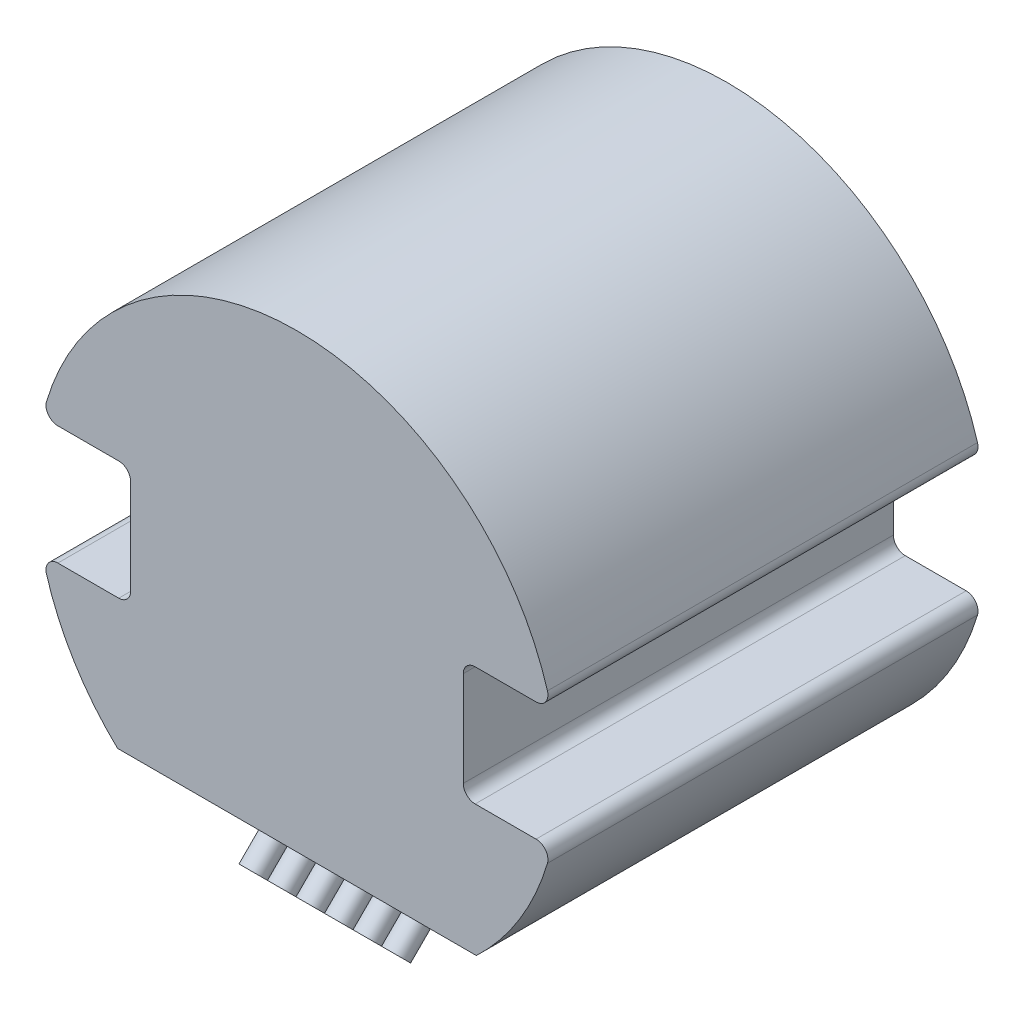
ISO-10303-21;
HEADER;
FILE_DESCRIPTION(('STEP AP214'),'2;1');
FILE_NAME('part.step','',(''),(''),'','','');
FILE_SCHEMA(('AUTOMOTIVE_DESIGN { 1 0 10303 214 1 1 1 1 }'));
ENDSEC;
DATA;
#1=APPLICATION_CONTEXT('core data for automotive mechanical design processes');
#2=APPLICATION_PROTOCOL_DEFINITION('international standard','automotive_design',2000,#1);
#3=PRODUCT_CONTEXT('',#1,'mechanical');
#4=PRODUCT('Part','Part','',(#3));
#5=PRODUCT_RELATED_PRODUCT_CATEGORY('part','',(#4));
#6=PRODUCT_DEFINITION_FORMATION('','',#4);
#7=PRODUCT_DEFINITION_CONTEXT('part definition',#1,'design');
#8=PRODUCT_DEFINITION('design','',#6,#7);
#9=PRODUCT_DEFINITION_SHAPE('','',#8);
#10=(LENGTH_UNIT() NAMED_UNIT(*) SI_UNIT(.MILLI.,.METRE.));
#11=(NAMED_UNIT(*) PLANE_ANGLE_UNIT() SI_UNIT($,.RADIAN.));
#12=(NAMED_UNIT(*) SI_UNIT($,.STERADIAN.) SOLID_ANGLE_UNIT());
#13=UNCERTAINTY_MEASURE_WITH_UNIT(LENGTH_MEASURE(1.E-05),#10,'distance_accuracy_value','');
#14=(GEOMETRIC_REPRESENTATION_CONTEXT(3) GLOBAL_UNCERTAINTY_ASSIGNED_CONTEXT((#13)) GLOBAL_UNIT_ASSIGNED_CONTEXT((#10,
#11,#12)) REPRESENTATION_CONTEXT('',''));
#15=CARTESIAN_POINT('',(0.,0.,0.));
#16=DIRECTION('',(0.,0.,1.));
#17=DIRECTION('',(1.,0.,0.));
#18=AXIS2_PLACEMENT_3D('',#15,#16,#17);
#19=CARTESIAN_POINT('',(-7.54983443527075,-8.,14.1));
#20=DIRECTION('',(0.,1.,0.));
#21=DIRECTION('',(0.,0.,1.));
#22=AXIS2_PLACEMENT_3D('',#19,#20,#21);
#23=PLANE('',#22);
#24=CARTESIAN_POINT('',(0.6,-8.,14.1));
#25=DIRECTION('',(0.,1.,0.));
#26=DIRECTION('',(0.,0.,-1.));
#27=AXIS2_PLACEMENT_3D('',#24,#25,#26);
#28=ELLIPSE('',#27,0.707106781186549,0.5);
#29=CARTESIAN_POINT('',(1.1,-8.00000000000001,14.1));
#30=VERTEX_POINT('',#29);
#31=CARTESIAN_POINT('',(0.0999999999999994,-8.,14.1));
#32=VERTEX_POINT('',#31);
#33=EDGE_CURVE('E48',#30,#32,#28,.F.);
#34=ORIENTED_EDGE('',*,*,#33,.F.);
#35=DIRECTION('',(-1.,0.,0.));
#36=VECTOR('',#35,1.);
#37=CARTESIAN_POINT('',(-7.54983443527075,-8.,14.1));
#38=LINE('',#37,#36);
#39=CARTESIAN_POINT('',(1.3,-8.,14.1));
#40=VERTEX_POINT('',#39);
#41=EDGE_CURVE('E197',#40,#30,#38,.T.);
#42=ORIENTED_EDGE('',*,*,#41,.F.);
#43=CARTESIAN_POINT('',(1.8,-8.,14.1));
#44=DIRECTION('',(0.,1.,0.));
#45=DIRECTION('',(0.,0.,-1.));
#46=AXIS2_PLACEMENT_3D('',#43,#44,#45);
#47=ELLIPSE('',#46,0.707106781186549,0.5);
#48=CARTESIAN_POINT('',(2.3,-8.00000000000001,14.1));
#49=VERTEX_POINT('',#48);
#50=EDGE_CURVE('E54',#49,#40,#47,.F.);
#51=ORIENTED_EDGE('',*,*,#50,.F.);
#52=CARTESIAN_POINT('',(2.5,-8.,14.1));
#53=VERTEX_POINT('',#52);
#54=EDGE_CURVE('E205',#53,#49,#38,.T.);
#55=ORIENTED_EDGE('',*,*,#54,.F.);
#56=CARTESIAN_POINT('',(3.,-8.,14.1));
#57=DIRECTION('',(0.,1.,0.));
#58=DIRECTION('',(0.,0.,-1.));
#59=AXIS2_PLACEMENT_3D('',#56,#57,#58);
#60=ELLIPSE('',#59,0.70710678118655,0.500000000000001);
#61=CARTESIAN_POINT('',(3.5,-8.00000000000001,14.1));
#62=VERTEX_POINT('',#61);
#63=EDGE_CURVE('E356',#62,#53,#60,.F.);
#64=ORIENTED_EDGE('',*,*,#63,.F.);
#65=CARTESIAN_POINT('',(7.54983443527075,-8.,14.1));
#66=VERTEX_POINT('',#65);
#67=EDGE_CURVE('E207',#66,#62,#38,.T.);
#68=ORIENTED_EDGE('',*,*,#67,.F.);
#69=DIRECTION('',(0.,0.,1.));
#70=VECTOR('',#69,1.);
#71=CARTESIAN_POINT('',(7.54983443527075,-8.,14.1));
#72=LINE('',#71,#70);
#73=CARTESIAN_POINT('',(7.54983443527075,-8.,18.1));
#74=VERTEX_POINT('',#73);
#75=EDGE_CURVE('E213',#66,#74,#72,.T.);
#76=ORIENTED_EDGE('',*,*,#75,.T.);
#77=DIRECTION('',(-1.,0.,0.));
#78=VECTOR('',#77,1.);
#79=CARTESIAN_POINT('',(-7.54983443527075,-8.,18.1));
#80=LINE('',#79,#78);
#81=CARTESIAN_POINT('',(-7.54983443527075,-8.,18.1));
#82=VERTEX_POINT('',#81);
#83=EDGE_CURVE('E216',#74,#82,#80,.T.);
#84=ORIENTED_EDGE('',*,*,#83,.T.);
#85=DIRECTION('',(0.,0.,1.));
#86=VECTOR('',#85,1.);
#87=CARTESIAN_POINT('',(-7.54983443527075,-8.,14.1));
#88=LINE('',#87,#86);
#89=CARTESIAN_POINT('',(-7.54983443527075,-8.,14.1));
#90=VERTEX_POINT('',#89);
#91=EDGE_CURVE('E220',#90,#82,#88,.T.);
#92=ORIENTED_EDGE('',*,*,#91,.F.);
#93=CARTESIAN_POINT('',(-3.5,-8.,14.1));
#94=VERTEX_POINT('',#93);
#95=EDGE_CURVE('E208',#94,#90,#38,.T.);
#96=ORIENTED_EDGE('',*,*,#95,.F.);
#97=CARTESIAN_POINT('',(-3.,-8.,14.1));
#98=DIRECTION('',(0.,1.,0.));
#99=DIRECTION('',(0.,0.,-1.));
#100=AXIS2_PLACEMENT_3D('',#97,#98,#99);
#101=ELLIPSE('',#100,0.70710678118655,0.500000000000001);
#102=CARTESIAN_POINT('',(-2.5,-8.00000000000001,14.1));
#103=VERTEX_POINT('',#102);
#104=EDGE_CURVE('E368',#103,#94,#101,.F.);
#105=ORIENTED_EDGE('',*,*,#104,.F.);
#106=CARTESIAN_POINT('',(-2.3,-8.,14.1));
#107=VERTEX_POINT('',#106);
#108=EDGE_CURVE('E384',#107,#103,#38,.T.);
#109=ORIENTED_EDGE('',*,*,#108,.F.);
#110=CARTESIAN_POINT('',(-1.8,-8.,14.1));
#111=DIRECTION('',(0.,1.,0.));
#112=DIRECTION('',(0.,0.,-1.));
#113=AXIS2_PLACEMENT_3D('',#110,#111,#112);
#114=ELLIPSE('',#113,0.707106781186549,0.5);
#115=CARTESIAN_POINT('',(-1.3,-8.00000000000001,14.1));
#116=VERTEX_POINT('',#115);
#117=EDGE_CURVE('E373',#116,#107,#114,.F.);
#118=ORIENTED_EDGE('',*,*,#117,.F.);
#119=CARTESIAN_POINT('',(-1.1,-8.,14.1));
#120=VERTEX_POINT('',#119);
#121=EDGE_CURVE('E209',#120,#116,#38,.T.);
#122=ORIENTED_EDGE('',*,*,#121,.F.);
#123=CARTESIAN_POINT('',(-0.6,-8.,14.1));
#124=DIRECTION('',(0.,1.,0.));
#125=DIRECTION('',(0.,0.,-1.));
#126=AXIS2_PLACEMENT_3D('',#123,#124,#125);
#127=ELLIPSE('',#126,0.707106781186549,0.500000000000001);
#128=CARTESIAN_POINT('',(-0.0999999999999995,-8.00000000000001,14.1));
#129=VERTEX_POINT('',#128);
#130=EDGE_CURVE('E219',#129,#120,#127,.F.);
#131=ORIENTED_EDGE('',*,*,#130,.F.);
#132=EDGE_CURVE('E199',#32,#129,#38,.T.);
#133=ORIENTED_EDGE('',*,*,#132,.F.);
#134=EDGE_LOOP('',(#34,#42,#51,#55,#64,#68,#76,#84,#92,#96,#105,#109,#118,#122,#131,#133));
#135=FACE_BOUND('',#134,.T.);
#136=ADVANCED_FACE('F34',(#135),#23,.F.);
#137=CARTESIAN_POINT('',(0.,0.,14.1));
#138=DIRECTION('',(0.,0.,1.));
#139=DIRECTION('',(1.,0.,0.));
#140=AXIS2_PLACEMENT_3D('',#137,#138,#139);
#141=PLANE('',#140);
#142=ORIENTED_EDGE('',*,*,#41,.T.);
#143=CARTESIAN_POINT('',(0.6,-8.,14.1));
#144=DIRECTION('',(0.,0.,1.));
#145=DIRECTION('',(0.,1.,0.));
#146=AXIS2_PLACEMENT_3D('',#143,#144,#145);
#147=ELLIPSE('',#146,0.707106781186547,0.5);
#148=EDGE_CURVE('E11',#30,#32,#147,.F.);
#149=ORIENTED_EDGE('',*,*,#148,.T.);
#150=ORIENTED_EDGE('',*,*,#132,.T.);
#151=CARTESIAN_POINT('',(-0.6,-8.,14.1));
#152=DIRECTION('',(0.,0.,1.));
#153=DIRECTION('',(0.,1.,0.));
#154=AXIS2_PLACEMENT_3D('',#151,#152,#153);
#155=ELLIPSE('',#154,0.707106781186547,0.500000000000001);
#156=EDGE_CURVE('E341',#129,#120,#155,.F.);
#157=ORIENTED_EDGE('',*,*,#156,.T.);
#158=ORIENTED_EDGE('',*,*,#121,.T.);
#159=CARTESIAN_POINT('',(-1.8,-8.,14.1));
#160=DIRECTION('',(0.,0.,1.));
#161=DIRECTION('',(0.,1.,0.));
#162=AXIS2_PLACEMENT_3D('',#159,#160,#161);
#163=ELLIPSE('',#162,0.707106781186546,0.5);
#164=EDGE_CURVE('E344',#116,#107,#163,.F.);
#165=ORIENTED_EDGE('',*,*,#164,.T.);
#166=ORIENTED_EDGE('',*,*,#108,.T.);
#167=CARTESIAN_POINT('',(-3.,-8.,14.1));
#168=DIRECTION('',(0.,0.,1.));
#169=DIRECTION('',(0.,1.,0.));
#170=AXIS2_PLACEMENT_3D('',#167,#168,#169);
#171=ELLIPSE('',#170,0.707106781186547,0.500000000000001);
#172=EDGE_CURVE('E347',#103,#94,#171,.F.);
#173=ORIENTED_EDGE('',*,*,#172,.T.);
#174=ORIENTED_EDGE('',*,*,#95,.T.);
#175=CARTESIAN_POINT('',(0.,0.,14.1));
#176=DIRECTION('',(0.,0.,1.));
#177=DIRECTION('',(1.,0.,0.));
#178=AXIS2_PLACEMENT_3D('',#175,#176,#177);
#179=CIRCLE('',#178,11.);
#180=EDGE_CURVE('E214',#90,#66,#179,.T.);
#181=ORIENTED_EDGE('',*,*,#180,.T.);
#182=ORIENTED_EDGE('',*,*,#67,.T.);
#183=CARTESIAN_POINT('',(3.,-8.,14.1));
#184=DIRECTION('',(0.,0.,1.));
#185=DIRECTION('',(0.,1.,0.));
#186=AXIS2_PLACEMENT_3D('',#183,#184,#185);
#187=ELLIPSE('',#186,0.707106781186547,0.500000000000001);
#188=EDGE_CURVE('E350',#62,#53,#187,.F.);
#189=ORIENTED_EDGE('',*,*,#188,.T.);
#190=ORIENTED_EDGE('',*,*,#54,.T.);
#191=CARTESIAN_POINT('',(1.8,-8.,14.1));
#192=DIRECTION('',(0.,0.,1.));
#193=DIRECTION('',(0.,1.,0.));
#194=AXIS2_PLACEMENT_3D('',#191,#192,#193);
#195=ELLIPSE('',#194,0.707106781186546,0.5);
#196=EDGE_CURVE('E42',#49,#40,#195,.F.);
#197=ORIENTED_EDGE('',*,*,#196,.T.);
#198=EDGE_LOOP('',(#142,#149,#150,#157,#158,#165,#166,#173,#174,#181,#182,#189,#190,#197));
#199=FACE_BOUND('',#198,.T.);
#200=ADVANCED_FACE('F203',(#199),#141,.T.);
#201=CARTESIAN_POINT('',(0.,0.,18.1));
#202=DIRECTION('',(0.,0.,-1.));
#203=DIRECTION('',(-1.,0.,0.));
#204=AXIS2_PLACEMENT_3D('',#201,#202,#203);
#205=CYLINDRICAL_SURFACE('',#204,11.);
#206=CARTESIAN_POINT('',(0.,0.,0.));
#207=DIRECTION('',(0.,0.,1.));
#208=DIRECTION('',(1.,0.,0.));
#209=AXIS2_PLACEMENT_3D('',#206,#207,#208);
#210=CIRCLE('',#209,11.);
#211=CARTESIAN_POINT('',(-10.541463322499,-3.14285714285714,0.));
#212=VERTEX_POINT('',#211);
#213=CARTESIAN_POINT('',(10.541463322499,-3.14285714285714,0.));
#214=VERTEX_POINT('',#213);
#215=EDGE_CURVE('E235',#212,#214,#210,.T.);
#216=ORIENTED_EDGE('',*,*,#215,.T.);
#217=DIRECTION('',(0.,0.,-1.));
#218=VECTOR('',#217,1.);
#219=CARTESIAN_POINT('',(10.541463322499,-3.14285714285714,18.1));
#220=LINE('',#219,#218);
#221=CARTESIAN_POINT('',(10.541463322499,-3.14285714285714,18.1));
#222=VERTEX_POINT('',#221);
#223=EDGE_CURVE('E271',#214,#222,#220,.F.);
#224=ORIENTED_EDGE('',*,*,#223,.T.);
#225=CARTESIAN_POINT('',(0.,0.,18.1));
#226=DIRECTION('',(0.,0.,1.));
#227=DIRECTION('',(1.,0.,0.));
#228=AXIS2_PLACEMENT_3D('',#225,#226,#227);
#229=CIRCLE('',#228,11.);
#230=EDGE_CURVE('E266',#74,#222,#229,.T.);
#231=ORIENTED_EDGE('',*,*,#230,.F.);
#232=ORIENTED_EDGE('',*,*,#75,.F.);
#233=ORIENTED_EDGE('',*,*,#180,.F.);
#234=ORIENTED_EDGE('',*,*,#91,.T.);
#235=CARTESIAN_POINT('',(-10.541463322499,-3.14285714285714,18.1));
#236=VERTEX_POINT('',#235);
#237=EDGE_CURVE('E265',#236,#82,#229,.T.);
#238=ORIENTED_EDGE('',*,*,#237,.F.);
#239=DIRECTION('',(0.,0.,-1.));
#240=VECTOR('',#239,1.);
#241=CARTESIAN_POINT('',(-10.541463322499,-3.14285714285714,18.1));
#242=LINE('',#241,#240);
#243=EDGE_CURVE('E264',#236,#212,#242,.T.);
#244=ORIENTED_EDGE('',*,*,#243,.T.);
#245=EDGE_LOOP('',(#216,#224,#231,#232,#233,#234,#238,#244));
#246=FACE_BOUND('',#245,.T.);
#247=ADVANCED_FACE('F394',(#246),#205,.T.);
#248=CARTESIAN_POINT('',(10.541463322499,3.14285714285714,18.1));
#249=VERTEX_POINT('',#248);
#250=CARTESIAN_POINT('',(-10.541463322499,3.14285714285714,18.1));
#251=VERTEX_POINT('',#250);
#252=EDGE_CURVE('E261',#249,#251,#229,.T.);
#253=ORIENTED_EDGE('',*,*,#252,.F.);
#254=DIRECTION('',(0.,0.,-1.));
#255=VECTOR('',#254,1.);
#256=CARTESIAN_POINT('',(10.541463322499,3.14285714285714,18.1));
#257=LINE('',#256,#255);
#258=CARTESIAN_POINT('',(10.541463322499,3.14285714285714,0.));
#259=VERTEX_POINT('',#258);
#260=EDGE_CURVE('E308',#249,#259,#257,.T.);
#261=ORIENTED_EDGE('',*,*,#260,.T.);
#262=CARTESIAN_POINT('',(-10.541463322499,3.14285714285714,0.));
#263=VERTEX_POINT('',#262);
#264=EDGE_CURVE('E267',#259,#263,#210,.T.);
#265=ORIENTED_EDGE('',*,*,#264,.T.);
#266=DIRECTION('',(0.,0.,-1.));
#267=VECTOR('',#266,1.);
#268=CARTESIAN_POINT('',(-10.541463322499,3.14285714285714,18.1));
#269=LINE('',#268,#267);
#270=EDGE_CURVE('E305',#263,#251,#269,.F.);
#271=ORIENTED_EDGE('',*,*,#270,.T.);
#272=EDGE_LOOP('',(#253,#261,#265,#271));
#273=FACE_BOUND('',#272,.T.);
#274=ADVANCED_FACE('F457',(#273),#205,.T.);
#275=CARTESIAN_POINT('',(0.,0.,18.1));
#276=DIRECTION('',(0.,0.,1.));
#277=DIRECTION('',(1.,0.,0.));
#278=AXIS2_PLACEMENT_3D('',#275,#276,#277);
#279=PLANE('',#278);
#280=ORIENTED_EDGE('',*,*,#230,.T.);
#281=CARTESIAN_POINT('',(10.0623058987491,-3.,18.1));
#282=DIRECTION('',(0.,0.,1.));
#283=DIRECTION('',(1.,0.,0.));
#284=AXIS2_PLACEMENT_3D('',#281,#282,#283);
#285=CIRCLE('',#284,0.5);
#286=CARTESIAN_POINT('',(10.0623058987491,-2.5,18.1));
#287=VERTEX_POINT('',#286);
#288=EDGE_CURVE('E280',#222,#287,#285,.T.);
#289=ORIENTED_EDGE('',*,*,#288,.T.);
#290=DIRECTION('',(1.,0.,0.));
#291=VECTOR('',#290,1.);
#292=CARTESIAN_POINT('',(10.7121426428143,-2.5,18.1));
#293=LINE('',#292,#291);
#294=CARTESIAN_POINT('',(7.5,-2.5,18.1));
#295=VERTEX_POINT('',#294);
#296=EDGE_CURVE('E229',#295,#287,#293,.T.);
#297=ORIENTED_EDGE('',*,*,#296,.F.);
#298=CARTESIAN_POINT('',(7.5,-2.,18.1));
#299=DIRECTION('',(0.,0.,1.));
#300=DIRECTION('',(1.,0.,0.));
#301=AXIS2_PLACEMENT_3D('',#298,#299,#300);
#302=CIRCLE('',#301,0.5);
#303=CARTESIAN_POINT('',(7.,-2.,18.1));
#304=VERTEX_POINT('',#303);
#305=EDGE_CURVE('E325',#295,#304,#302,.F.);
#306=ORIENTED_EDGE('',*,*,#305,.T.);
#307=DIRECTION('',(0.,-1.,0.));
#308=VECTOR('',#307,1.);
#309=CARTESIAN_POINT('',(7.,2.5,18.1));
#310=LINE('',#309,#308);
#311=CARTESIAN_POINT('',(7.,2.,18.1));
#312=VERTEX_POINT('',#311);
#313=EDGE_CURVE('E239',#312,#304,#310,.T.);
#314=ORIENTED_EDGE('',*,*,#313,.F.);
#315=CARTESIAN_POINT('',(7.5,2.,18.1));
#316=DIRECTION('',(0.,0.,1.));
#317=DIRECTION('',(1.,0.,0.));
#318=AXIS2_PLACEMENT_3D('',#315,#316,#317);
#319=CIRCLE('',#318,0.5);
#320=CARTESIAN_POINT('',(7.5,2.5,18.1));
#321=VERTEX_POINT('',#320);
#322=EDGE_CURVE('E329',#312,#321,#319,.F.);
#323=ORIENTED_EDGE('',*,*,#322,.T.);
#324=DIRECTION('',(-1.,0.,0.));
#325=VECTOR('',#324,1.);
#326=CARTESIAN_POINT('',(10.7121426428143,2.5,18.1));
#327=LINE('',#326,#325);
#328=CARTESIAN_POINT('',(10.0623058987491,2.5,18.1));
#329=VERTEX_POINT('',#328);
#330=EDGE_CURVE('E236',#329,#321,#327,.T.);
#331=ORIENTED_EDGE('',*,*,#330,.F.);
#332=CARTESIAN_POINT('',(10.0623058987491,3.,18.1));
#333=DIRECTION('',(0.,0.,1.));
#334=DIRECTION('',(1.,0.,0.));
#335=AXIS2_PLACEMENT_3D('',#332,#333,#334);
#336=CIRCLE('',#335,0.5);
#337=EDGE_CURVE('E278',#329,#249,#336,.T.);
#338=ORIENTED_EDGE('',*,*,#337,.T.);
#339=ORIENTED_EDGE('',*,*,#252,.T.);
#340=CARTESIAN_POINT('',(-10.0623058987491,3.,18.1));
#341=DIRECTION('',(0.,0.,1.));
#342=DIRECTION('',(1.,0.,0.));
#343=AXIS2_PLACEMENT_3D('',#340,#341,#342);
#344=CIRCLE('',#343,0.5);
#345=CARTESIAN_POINT('',(-10.0623058987491,2.5,18.1));
#346=VERTEX_POINT('',#345);
#347=EDGE_CURVE('E274',#251,#346,#344,.T.);
#348=ORIENTED_EDGE('',*,*,#347,.T.);
#349=DIRECTION('',(-1.,0.,0.));
#350=VECTOR('',#349,1.);
#351=CARTESIAN_POINT('',(-10.7121426428143,2.5,18.1));
#352=LINE('',#351,#350);
#353=CARTESIAN_POINT('',(-7.5,2.5,18.1));
#354=VERTEX_POINT('',#353);
#355=EDGE_CURVE('E249',#354,#346,#352,.T.);
#356=ORIENTED_EDGE('',*,*,#355,.F.);
#357=CARTESIAN_POINT('',(-7.5,2.,18.1));
#358=DIRECTION('',(0.,0.,1.));
#359=DIRECTION('',(1.,0.,0.));
#360=AXIS2_PLACEMENT_3D('',#357,#358,#359);
#361=CIRCLE('',#360,0.5);
#362=CARTESIAN_POINT('',(-7.,2.,18.1));
#363=VERTEX_POINT('',#362);
#364=EDGE_CURVE('E337',#354,#363,#361,.F.);
#365=ORIENTED_EDGE('',*,*,#364,.T.);
#366=DIRECTION('',(0.,1.,0.));
#367=VECTOR('',#366,1.);
#368=CARTESIAN_POINT('',(-7.,2.5,18.1));
#369=LINE('',#368,#367);
#370=CARTESIAN_POINT('',(-7.,-2.,18.1));
#371=VERTEX_POINT('',#370);
#372=EDGE_CURVE('E256',#371,#363,#369,.T.);
#373=ORIENTED_EDGE('',*,*,#372,.F.);
#374=CARTESIAN_POINT('',(-7.5,-2.,18.1));
#375=DIRECTION('',(0.,0.,1.));
#376=DIRECTION('',(1.,0.,0.));
#377=AXIS2_PLACEMENT_3D('',#374,#375,#376);
#378=CIRCLE('',#377,0.5);
#379=CARTESIAN_POINT('',(-7.5,-2.5,18.1));
#380=VERTEX_POINT('',#379);
#381=EDGE_CURVE('E333',#371,#380,#378,.F.);
#382=ORIENTED_EDGE('',*,*,#381,.T.);
#383=DIRECTION('',(1.,0.,0.));
#384=VECTOR('',#383,1.);
#385=CARTESIAN_POINT('',(-10.7121426428143,-2.5,18.1));
#386=LINE('',#385,#384);
#387=CARTESIAN_POINT('',(-10.0623058987491,-2.5,18.1));
#388=VERTEX_POINT('',#387);
#389=EDGE_CURVE('E223',#388,#380,#386,.T.);
#390=ORIENTED_EDGE('',*,*,#389,.F.);
#391=CARTESIAN_POINT('',(-10.0623058987491,-3.,18.1));
#392=DIRECTION('',(0.,0.,1.));
#393=DIRECTION('',(1.,0.,0.));
#394=AXIS2_PLACEMENT_3D('',#391,#392,#393);
#395=CIRCLE('',#394,0.5);
#396=EDGE_CURVE('E276',#388,#236,#395,.T.);
#397=ORIENTED_EDGE('',*,*,#396,.T.);
#398=ORIENTED_EDGE('',*,*,#237,.T.);
#399=ORIENTED_EDGE('',*,*,#83,.F.);
#400=EDGE_LOOP('',(#280,#289,#297,#306,#314,#323,#331,#338,#339,#348,#356,#365,#373,#382,#390,
#397,#398,#399));
#401=FACE_BOUND('',#400,.T.);
#402=ADVANCED_FACE('F399',(#401),#279,.T.);
#403=CARTESIAN_POINT('',(0.,0.,0.));
#404=DIRECTION('',(0.,0.,1.));
#405=DIRECTION('',(1.,0.,0.));
#406=AXIS2_PLACEMENT_3D('',#403,#404,#405);
#407=PLANE('',#406);
#408=DIRECTION('',(1.,0.,0.));
#409=VECTOR('',#408,1.);
#410=CARTESIAN_POINT('',(10.7121426428143,-2.5,0.));
#411=LINE('',#410,#409);
#412=CARTESIAN_POINT('',(7.5,-2.5,0.));
#413=VERTEX_POINT('',#412);
#414=CARTESIAN_POINT('',(10.0623058987491,-2.5,0.));
#415=VERTEX_POINT('',#414);
#416=EDGE_CURVE('E232',#413,#415,#411,.T.);
#417=ORIENTED_EDGE('',*,*,#416,.T.);
#418=CARTESIAN_POINT('',(10.0623058987491,-3.,0.));
#419=DIRECTION('',(0.,0.,1.));
#420=DIRECTION('',(1.,0.,0.));
#421=AXIS2_PLACEMENT_3D('',#418,#419,#420);
#422=CIRCLE('',#421,0.5);
#423=EDGE_CURVE('E293',#415,#214,#422,.F.);
#424=ORIENTED_EDGE('',*,*,#423,.T.);
#425=ORIENTED_EDGE('',*,*,#215,.F.);
#426=CARTESIAN_POINT('',(-10.0623058987491,-3.,0.));
#427=DIRECTION('',(0.,0.,1.));
#428=DIRECTION('',(1.,0.,0.));
#429=AXIS2_PLACEMENT_3D('',#426,#427,#428);
#430=CIRCLE('',#429,0.5);
#431=CARTESIAN_POINT('',(-10.0623058987491,-2.5,0.));
#432=VERTEX_POINT('',#431);
#433=EDGE_CURVE('E289',#212,#432,#430,.F.);
#434=ORIENTED_EDGE('',*,*,#433,.T.);
#435=DIRECTION('',(1.,0.,0.));
#436=VECTOR('',#435,1.);
#437=CARTESIAN_POINT('',(-10.7121426428143,-2.5,0.));
#438=LINE('',#437,#436);
#439=CARTESIAN_POINT('',(-7.5,-2.5,0.));
#440=VERTEX_POINT('',#439);
#441=EDGE_CURVE('E245',#432,#440,#438,.T.);
#442=ORIENTED_EDGE('',*,*,#441,.T.);
#443=CARTESIAN_POINT('',(-7.5,-2.,0.));
#444=DIRECTION('',(0.,0.,1.));
#445=DIRECTION('',(1.,0.,0.));
#446=AXIS2_PLACEMENT_3D('',#443,#444,#445);
#447=CIRCLE('',#446,0.5);
#448=CARTESIAN_POINT('',(-7.,-2.,0.));
#449=VERTEX_POINT('',#448);
#450=EDGE_CURVE('E335',#440,#449,#447,.T.);
#451=ORIENTED_EDGE('',*,*,#450,.T.);
#452=DIRECTION('',(0.,1.,0.));
#453=VECTOR('',#452,1.);
#454=CARTESIAN_POINT('',(-7.,2.5,0.));
#455=LINE('',#454,#453);
#456=CARTESIAN_POINT('',(-7.,2.,0.));
#457=VERTEX_POINT('',#456);
#458=EDGE_CURVE('E248',#449,#457,#455,.T.);
#459=ORIENTED_EDGE('',*,*,#458,.T.);
#460=CARTESIAN_POINT('',(-7.5,2.,0.));
#461=DIRECTION('',(0.,0.,1.));
#462=DIRECTION('',(1.,0.,0.));
#463=AXIS2_PLACEMENT_3D('',#460,#461,#462);
#464=CIRCLE('',#463,0.5);
#465=CARTESIAN_POINT('',(-7.5,2.5,0.));
#466=VERTEX_POINT('',#465);
#467=EDGE_CURVE('E339',#457,#466,#464,.T.);
#468=ORIENTED_EDGE('',*,*,#467,.T.);
#469=DIRECTION('',(-1.,0.,0.));
#470=VECTOR('',#469,1.);
#471=CARTESIAN_POINT('',(-10.7121426428143,2.5,0.));
#472=LINE('',#471,#470);
#473=CARTESIAN_POINT('',(-10.0623058987491,2.5,0.));
#474=VERTEX_POINT('',#473);
#475=EDGE_CURVE('E240',#466,#474,#472,.T.);
#476=ORIENTED_EDGE('',*,*,#475,.T.);
#477=CARTESIAN_POINT('',(-10.0623058987491,3.,0.));
#478=DIRECTION('',(0.,0.,1.));
#479=DIRECTION('',(1.,0.,0.));
#480=AXIS2_PLACEMENT_3D('',#477,#478,#479);
#481=CIRCLE('',#480,0.5);
#482=EDGE_CURVE('E287',#474,#263,#481,.F.);
#483=ORIENTED_EDGE('',*,*,#482,.T.);
#484=ORIENTED_EDGE('',*,*,#264,.F.);
#485=CARTESIAN_POINT('',(10.0623058987491,3.,0.));
#486=DIRECTION('',(0.,0.,1.));
#487=DIRECTION('',(1.,0.,0.));
#488=AXIS2_PLACEMENT_3D('',#485,#486,#487);
#489=CIRCLE('',#488,0.5);
#490=CARTESIAN_POINT('',(10.0623058987491,2.5,0.));
#491=VERTEX_POINT('',#490);
#492=EDGE_CURVE('E291',#259,#491,#489,.F.);
#493=ORIENTED_EDGE('',*,*,#492,.T.);
#494=DIRECTION('',(-1.,0.,0.));
#495=VECTOR('',#494,1.);
#496=CARTESIAN_POINT('',(10.7121426428143,2.5,0.));
#497=LINE('',#496,#495);
#498=CARTESIAN_POINT('',(7.5,2.5,0.));
#499=VERTEX_POINT('',#498);
#500=EDGE_CURVE('E225',#491,#499,#497,.T.);
#501=ORIENTED_EDGE('',*,*,#500,.T.);
#502=CARTESIAN_POINT('',(7.5,2.,0.));
#503=DIRECTION('',(0.,0.,1.));
#504=DIRECTION('',(1.,0.,0.));
#505=AXIS2_PLACEMENT_3D('',#502,#503,#504);
#506=CIRCLE('',#505,0.5);
#507=CARTESIAN_POINT('',(7.,2.,0.));
#508=VERTEX_POINT('',#507);
#509=EDGE_CURVE('E331',#499,#508,#506,.T.);
#510=ORIENTED_EDGE('',*,*,#509,.T.);
#511=DIRECTION('',(0.,-1.,0.));
#512=VECTOR('',#511,1.);
#513=CARTESIAN_POINT('',(7.,2.5,0.));
#514=LINE('',#513,#512);
#515=CARTESIAN_POINT('',(7.,-2.,0.));
#516=VERTEX_POINT('',#515);
#517=EDGE_CURVE('E228',#508,#516,#514,.T.);
#518=ORIENTED_EDGE('',*,*,#517,.T.);
#519=CARTESIAN_POINT('',(7.5,-2.,0.));
#520=DIRECTION('',(0.,0.,1.));
#521=DIRECTION('',(1.,0.,0.));
#522=AXIS2_PLACEMENT_3D('',#519,#520,#521);
#523=CIRCLE('',#522,0.5);
#524=EDGE_CURVE('E327',#516,#413,#523,.T.);
#525=ORIENTED_EDGE('',*,*,#524,.T.);
#526=EDGE_LOOP('',(#417,#424,#425,#434,#442,#451,#459,#468,#476,#483,#484,#493,#501,#510,#518,#525));
#527=FACE_BOUND('',#526,.T.);
#528=ADVANCED_FACE('F447',(#527),#407,.F.);
#529=CARTESIAN_POINT('',(-10.7121426428143,2.5,0.));
#530=DIRECTION('',(0.,1.,0.));
#531=DIRECTION('',(-1.,0.,0.));
#532=AXIS2_PLACEMENT_3D('',#529,#530,#531);
#533=PLANE('',#532);
#534=ORIENTED_EDGE('',*,*,#475,.F.);
#535=DIRECTION('',(0.,0.,1.));
#536=VECTOR('',#535,1.);
#537=CARTESIAN_POINT('',(-7.5,2.5,18.1));
#538=LINE('',#537,#536);
#539=EDGE_CURVE('E322',#466,#354,#538,.T.);
#540=ORIENTED_EDGE('',*,*,#539,.T.);
#541=ORIENTED_EDGE('',*,*,#355,.T.);
#542=DIRECTION('',(0.,0.,-1.));
#543=VECTOR('',#542,1.);
#544=CARTESIAN_POINT('',(-10.0623058987491,2.5,0.));
#545=LINE('',#544,#543);
#546=EDGE_CURVE('E320',#346,#474,#545,.T.);
#547=ORIENTED_EDGE('',*,*,#546,.T.);
#548=EDGE_LOOP('',(#534,#540,#541,#547));
#549=FACE_BOUND('',#548,.T.);
#550=ADVANCED_FACE('F443',(#549),#533,.F.);
#551=CARTESIAN_POINT('',(-7.,2.5,0.));
#552=DIRECTION('',(1.,0.,0.));
#553=DIRECTION('',(0.,0.,-1.));
#554=AXIS2_PLACEMENT_3D('',#551,#552,#553);
#555=PLANE('',#554);
#556=ORIENTED_EDGE('',*,*,#458,.F.);
#557=DIRECTION('',(0.,0.,1.));
#558=VECTOR('',#557,1.);
#559=CARTESIAN_POINT('',(-7.,-2.,18.1));
#560=LINE('',#559,#558);
#561=EDGE_CURVE('E317',#449,#371,#560,.T.);
#562=ORIENTED_EDGE('',*,*,#561,.T.);
#563=ORIENTED_EDGE('',*,*,#372,.T.);
#564=DIRECTION('',(0.,0.,1.));
#565=VECTOR('',#564,1.);
#566=CARTESIAN_POINT('',(-7.,2.,0.));
#567=LINE('',#566,#565);
#568=EDGE_CURVE('E315',#363,#457,#567,.F.);
#569=ORIENTED_EDGE('',*,*,#568,.T.);
#570=EDGE_LOOP('',(#556,#562,#563,#569));
#571=FACE_BOUND('',#570,.T.);
#572=ADVANCED_FACE('F446',(#571),#555,.F.);
#573=CARTESIAN_POINT('',(-10.7121426428143,-2.5,0.));
#574=DIRECTION('',(0.,-1.,0.));
#575=DIRECTION('',(1.,0.,0.));
#576=AXIS2_PLACEMENT_3D('',#573,#574,#575);
#577=PLANE('',#576);
#578=ORIENTED_EDGE('',*,*,#441,.F.);
#579=DIRECTION('',(0.,0.,-1.));
#580=VECTOR('',#579,1.);
#581=CARTESIAN_POINT('',(-10.0623058987491,-2.5,0.));
#582=LINE('',#581,#580);
#583=EDGE_CURVE('E312',#432,#388,#582,.F.);
#584=ORIENTED_EDGE('',*,*,#583,.T.);
#585=ORIENTED_EDGE('',*,*,#389,.T.);
#586=DIRECTION('',(0.,0.,1.));
#587=VECTOR('',#586,1.);
#588=CARTESIAN_POINT('',(-7.5,-2.5,0.));
#589=LINE('',#588,#587);
#590=EDGE_CURVE('E310',#380,#440,#589,.F.);
#591=ORIENTED_EDGE('',*,*,#590,.T.);
#592=EDGE_LOOP('',(#578,#584,#585,#591));
#593=FACE_BOUND('',#592,.T.);
#594=ADVANCED_FACE('F433',(#593),#577,.F.);
#595=CARTESIAN_POINT('',(10.7121426428143,-2.5,0.));
#596=DIRECTION('',(0.,-1.,0.));
#597=DIRECTION('',(1.,0.,0.));
#598=AXIS2_PLACEMENT_3D('',#595,#596,#597);
#599=PLANE('',#598);
#600=ORIENTED_EDGE('',*,*,#296,.T.);
#601=DIRECTION('',(0.,0.,-1.));
#602=VECTOR('',#601,1.);
#603=CARTESIAN_POINT('',(10.0623058987491,-2.5,0.));
#604=LINE('',#603,#602);
#605=EDGE_CURVE('E285',#287,#415,#604,.T.);
#606=ORIENTED_EDGE('',*,*,#605,.T.);
#607=ORIENTED_EDGE('',*,*,#416,.F.);
#608=DIRECTION('',(0.,0.,1.));
#609=VECTOR('',#608,1.);
#610=CARTESIAN_POINT('',(7.5,-2.5,18.1));
#611=LINE('',#610,#609);
#612=EDGE_CURVE('E282',#413,#295,#611,.T.);
#613=ORIENTED_EDGE('',*,*,#612,.T.);
#614=EDGE_LOOP('',(#600,#606,#607,#613));
#615=FACE_BOUND('',#614,.T.);
#616=ADVANCED_FACE('F429',(#615),#599,.F.);
#617=CARTESIAN_POINT('',(7.,2.5,0.));
#618=DIRECTION('',(-1.,0.,0.));
#619=DIRECTION('',(0.,0.,1.));
#620=AXIS2_PLACEMENT_3D('',#617,#618,#619);
#621=PLANE('',#620);
#622=ORIENTED_EDGE('',*,*,#313,.T.);
#623=DIRECTION('',(0.,0.,1.));
#624=VECTOR('',#623,1.);
#625=CARTESIAN_POINT('',(7.,-2.,0.));
#626=LINE('',#625,#624);
#627=EDGE_CURVE('E298',#304,#516,#626,.F.);
#628=ORIENTED_EDGE('',*,*,#627,.T.);
#629=ORIENTED_EDGE('',*,*,#517,.F.);
#630=DIRECTION('',(0.,0.,1.));
#631=VECTOR('',#630,1.);
#632=CARTESIAN_POINT('',(7.,2.,18.1));
#633=LINE('',#632,#631);
#634=EDGE_CURVE('E295',#508,#312,#633,.T.);
#635=ORIENTED_EDGE('',*,*,#634,.T.);
#636=EDGE_LOOP('',(#622,#628,#629,#635));
#637=FACE_BOUND('',#636,.T.);
#638=ADVANCED_FACE('F432',(#637),#621,.F.);
#639=CARTESIAN_POINT('',(10.7121426428143,2.5,0.));
#640=DIRECTION('',(0.,1.,0.));
#641=DIRECTION('',(-1.,0.,0.));
#642=AXIS2_PLACEMENT_3D('',#639,#640,#641);
#643=PLANE('',#642);
#644=ORIENTED_EDGE('',*,*,#500,.F.);
#645=DIRECTION('',(0.,0.,-1.));
#646=VECTOR('',#645,1.);
#647=CARTESIAN_POINT('',(10.0623058987491,2.5,0.));
#648=LINE('',#647,#646);
#649=EDGE_CURVE('E302',#491,#329,#648,.F.);
#650=ORIENTED_EDGE('',*,*,#649,.T.);
#651=ORIENTED_EDGE('',*,*,#330,.T.);
#652=DIRECTION('',(0.,0.,1.));
#653=VECTOR('',#652,1.);
#654=CARTESIAN_POINT('',(7.5,2.5,0.));
#655=LINE('',#654,#653);
#656=EDGE_CURVE('E300',#321,#499,#655,.F.);
#657=ORIENTED_EDGE('',*,*,#656,.T.);
#658=EDGE_LOOP('',(#644,#650,#651,#657));
#659=FACE_BOUND('',#658,.T.);
#660=ADVANCED_FACE('F437',(#659),#643,.F.);
#661=CARTESIAN_POINT('',(10.0623058987491,-3.,18.1));
#662=DIRECTION('',(0.,0.,-1.));
#663=DIRECTION('',(-1.,0.,0.));
#664=AXIS2_PLACEMENT_3D('',#661,#662,#663);
#665=CYLINDRICAL_SURFACE('',#664,0.5);
#666=ORIENTED_EDGE('',*,*,#423,.F.);
#667=ORIENTED_EDGE('',*,*,#605,.F.);
#668=ORIENTED_EDGE('',*,*,#288,.F.);
#669=ORIENTED_EDGE('',*,*,#223,.F.);
#670=EDGE_LOOP('',(#666,#667,#668,#669));
#671=FACE_BOUND('',#670,.T.);
#672=ADVANCED_FACE('F441',(#671),#665,.T.);
#673=CARTESIAN_POINT('',(7.5,-2.,0.));
#674=DIRECTION('',(0.,0.,-1.));
#675=DIRECTION('',(-1.,0.,0.));
#676=AXIS2_PLACEMENT_3D('',#673,#674,#675);
#677=CYLINDRICAL_SURFACE('',#676,0.5);
#678=ORIENTED_EDGE('',*,*,#524,.F.);
#679=ORIENTED_EDGE('',*,*,#627,.F.);
#680=ORIENTED_EDGE('',*,*,#305,.F.);
#681=ORIENTED_EDGE('',*,*,#612,.F.);
#682=EDGE_LOOP('',(#678,#679,#680,#681));
#683=FACE_BOUND('',#682,.T.);
#684=ADVANCED_FACE('F466',(#683),#677,.F.);
#685=CARTESIAN_POINT('',(10.0623058987491,3.,18.1));
#686=DIRECTION('',(0.,0.,-1.));
#687=DIRECTION('',(-1.,0.,0.));
#688=AXIS2_PLACEMENT_3D('',#685,#686,#687);
#689=CYLINDRICAL_SURFACE('',#688,0.5);
#690=ORIENTED_EDGE('',*,*,#492,.F.);
#691=ORIENTED_EDGE('',*,*,#260,.F.);
#692=ORIENTED_EDGE('',*,*,#337,.F.);
#693=ORIENTED_EDGE('',*,*,#649,.F.);
#694=EDGE_LOOP('',(#690,#691,#692,#693));
#695=FACE_BOUND('',#694,.T.);
#696=ADVANCED_FACE('F470',(#695),#689,.T.);
#697=CARTESIAN_POINT('',(7.5,2.,0.));
#698=DIRECTION('',(0.,0.,-1.));
#699=DIRECTION('',(-1.,0.,0.));
#700=AXIS2_PLACEMENT_3D('',#697,#698,#699);
#701=CYLINDRICAL_SURFACE('',#700,0.5);
#702=ORIENTED_EDGE('',*,*,#509,.F.);
#703=ORIENTED_EDGE('',*,*,#656,.F.);
#704=ORIENTED_EDGE('',*,*,#322,.F.);
#705=ORIENTED_EDGE('',*,*,#634,.F.);
#706=EDGE_LOOP('',(#702,#703,#704,#705));
#707=FACE_BOUND('',#706,.T.);
#708=ADVANCED_FACE('F474',(#707),#701,.F.);
#709=CARTESIAN_POINT('',(-10.0623058987491,-3.,18.1));
#710=DIRECTION('',(0.,0.,-1.));
#711=DIRECTION('',(-1.,0.,0.));
#712=AXIS2_PLACEMENT_3D('',#709,#710,#711);
#713=CYLINDRICAL_SURFACE('',#712,0.5);
#714=ORIENTED_EDGE('',*,*,#433,.F.);
#715=ORIENTED_EDGE('',*,*,#243,.F.);
#716=ORIENTED_EDGE('',*,*,#396,.F.);
#717=ORIENTED_EDGE('',*,*,#583,.F.);
#718=EDGE_LOOP('',(#714,#715,#716,#717));
#719=FACE_BOUND('',#718,.T.);
#720=ADVANCED_FACE('F478',(#719),#713,.T.);
#721=CARTESIAN_POINT('',(-7.5,-2.,0.));
#722=DIRECTION('',(0.,0.,-1.));
#723=DIRECTION('',(-1.,0.,0.));
#724=AXIS2_PLACEMENT_3D('',#721,#722,#723);
#725=CYLINDRICAL_SURFACE('',#724,0.5);
#726=ORIENTED_EDGE('',*,*,#450,.F.);
#727=ORIENTED_EDGE('',*,*,#590,.F.);
#728=ORIENTED_EDGE('',*,*,#381,.F.);
#729=ORIENTED_EDGE('',*,*,#561,.F.);
#730=EDGE_LOOP('',(#726,#727,#728,#729));
#731=FACE_BOUND('',#730,.T.);
#732=ADVANCED_FACE('F482',(#731),#725,.F.);
#733=CARTESIAN_POINT('',(-7.5,2.,0.));
#734=DIRECTION('',(0.,0.,-1.));
#735=DIRECTION('',(-1.,0.,0.));
#736=AXIS2_PLACEMENT_3D('',#733,#734,#735);
#737=CYLINDRICAL_SURFACE('',#736,0.5);
#738=ORIENTED_EDGE('',*,*,#467,.F.);
#739=ORIENTED_EDGE('',*,*,#568,.F.);
#740=ORIENTED_EDGE('',*,*,#364,.F.);
#741=ORIENTED_EDGE('',*,*,#539,.F.);
#742=EDGE_LOOP('',(#738,#739,#740,#741));
#743=FACE_BOUND('',#742,.T.);
#744=ADVANCED_FACE('F485',(#743),#737,.F.);
#745=CARTESIAN_POINT('',(-10.0623058987491,3.,18.1));
#746=DIRECTION('',(0.,0.,-1.));
#747=DIRECTION('',(-1.,0.,0.));
#748=AXIS2_PLACEMENT_3D('',#745,#746,#747);
#749=CYLINDRICAL_SURFACE('',#748,0.5);
#750=ORIENTED_EDGE('',*,*,#482,.F.);
#751=ORIENTED_EDGE('',*,*,#546,.F.);
#752=ORIENTED_EDGE('',*,*,#347,.F.);
#753=ORIENTED_EDGE('',*,*,#270,.F.);
#754=EDGE_LOOP('',(#750,#751,#752,#753));
#755=FACE_BOUND('',#754,.T.);
#756=ADVANCED_FACE('F36',(#755),#749,.T.);
#757=CARTESIAN_POINT('',(-0.6,-10.8284271247462,16.9284271247462));
#758=DIRECTION('',(0.,0.707106781186546,-0.707106781186549));
#759=DIRECTION('',(0.,0.707106781186549,0.707106781186546));
#760=AXIS2_PLACEMENT_3D('',#757,#758,#759);
#761=CYLINDRICAL_SURFACE('',#760,0.500000000000001);
#762=CARTESIAN_POINT('',(-0.6,-10.8284271247462,16.9284271247462));
#763=DIRECTION('',(0.,-0.707106781186546,0.707106781186549));
#764=DIRECTION('',(0.,-0.707106781186549,-0.707106781186546));
#765=AXIS2_PLACEMENT_3D('',#762,#763,#764);
#766=CIRCLE('',#765,0.500000000000001);
#767=CARTESIAN_POINT('',(-0.6,-11.1819805153395,16.5748737341529));
#768=VERTEX_POINT('',#767);
#769=EDGE_CURVE('E375',#768,#768,#766,.T.);
#770=ORIENTED_EDGE('',*,*,#769,.F.);
#771=EDGE_LOOP('',(#770));
#772=FACE_BOUND('',#771,.T.);
#773=ORIENTED_EDGE('',*,*,#156,.F.);
#774=ORIENTED_EDGE('',*,*,#130,.T.);
#775=EDGE_LOOP('',(#773,#774));
#776=FACE_BOUND('',#775,.T.);
#777=ADVANCED_FACE('F379',(#772,#776),#761,.T.);
#778=CARTESIAN_POINT('',(-0.6,-10.8284271247462,16.9284271247462));
#779=DIRECTION('',(0.,-0.707106781186546,0.707106781186549));
#780=DIRECTION('',(0.,-0.707106781186549,-0.707106781186546));
#781=AXIS2_PLACEMENT_3D('',#778,#779,#780);
#782=PLANE('',#781);
#783=ORIENTED_EDGE('',*,*,#769,.T.);
#784=EDGE_LOOP('',(#783));
#785=FACE_BOUND('',#784,.T.);
#786=ADVANCED_FACE('F532',(#785),#782,.T.);
#787=CARTESIAN_POINT('',(-1.8,-10.8284271247462,16.9284271247462));
#788=DIRECTION('',(0.,0.707106781186546,-0.707106781186549));
#789=DIRECTION('',(0.,0.707106781186549,0.707106781186546));
#790=AXIS2_PLACEMENT_3D('',#787,#788,#789);
#791=CYLINDRICAL_SURFACE('',#790,0.5);
#792=CARTESIAN_POINT('',(-1.8,-10.8284271247462,16.9284271247462));
#793=DIRECTION('',(0.,-0.707106781186546,0.707106781186549));
#794=DIRECTION('',(0.,-0.707106781186549,-0.707106781186546));
#795=AXIS2_PLACEMENT_3D('',#792,#793,#794);
#796=CIRCLE('',#795,0.5);
#797=CARTESIAN_POINT('',(-1.8,-11.1819805153395,16.5748737341529));
#798=VERTEX_POINT('',#797);
#799=EDGE_CURVE('E370',#798,#798,#796,.T.);
#800=ORIENTED_EDGE('',*,*,#799,.F.);
#801=EDGE_LOOP('',(#800));
#802=FACE_BOUND('',#801,.T.);
#803=ORIENTED_EDGE('',*,*,#164,.F.);
#804=ORIENTED_EDGE('',*,*,#117,.T.);
#805=EDGE_LOOP('',(#803,#804));
#806=FACE_BOUND('',#805,.T.);
#807=ADVANCED_FACE('F417',(#802,#806),#791,.T.);
#808=CARTESIAN_POINT('',(-1.8,-10.8284271247462,16.9284271247462));
#809=DIRECTION('',(0.,-0.707106781186546,0.707106781186549));
#810=DIRECTION('',(0.,-0.707106781186549,-0.707106781186546));
#811=AXIS2_PLACEMENT_3D('',#808,#809,#810);
#812=PLANE('',#811);
#813=ORIENTED_EDGE('',*,*,#799,.T.);
#814=EDGE_LOOP('',(#813));
#815=FACE_BOUND('',#814,.T.);
#816=ADVANCED_FACE('F407',(#815),#812,.T.);
#817=CARTESIAN_POINT('',(-3.,-10.8284271247462,16.9284271247462));
#818=DIRECTION('',(0.,0.707106781186546,-0.707106781186549));
#819=DIRECTION('',(0.,0.707106781186549,0.707106781186546));
#820=AXIS2_PLACEMENT_3D('',#817,#818,#819);
#821=CYLINDRICAL_SURFACE('',#820,0.500000000000001);
#822=CARTESIAN_POINT('',(-3.,-10.8284271247462,16.9284271247462));
#823=DIRECTION('',(0.,-0.707106781186546,0.707106781186549));
#824=DIRECTION('',(0.,-0.707106781186549,-0.707106781186546));
#825=AXIS2_PLACEMENT_3D('',#822,#823,#824);
#826=CIRCLE('',#825,0.500000000000001);
#827=CARTESIAN_POINT('',(-3.,-11.1819805153395,16.5748737341529));
#828=VERTEX_POINT('',#827);
#829=EDGE_CURVE('E365',#828,#828,#826,.T.);
#830=ORIENTED_EDGE('',*,*,#829,.F.);
#831=EDGE_LOOP('',(#830));
#832=FACE_BOUND('',#831,.T.);
#833=ORIENTED_EDGE('',*,*,#172,.F.);
#834=ORIENTED_EDGE('',*,*,#104,.T.);
#835=EDGE_LOOP('',(#833,#834));
#836=FACE_BOUND('',#835,.T.);
#837=ADVANCED_FACE('F404',(#832,#836),#821,.T.);
#838=CARTESIAN_POINT('',(-3.,-10.8284271247462,16.9284271247462));
#839=DIRECTION('',(0.,-0.707106781186546,0.707106781186549));
#840=DIRECTION('',(0.,-0.707106781186549,-0.707106781186546));
#841=AXIS2_PLACEMENT_3D('',#838,#839,#840);
#842=PLANE('',#841);
#843=ORIENTED_EDGE('',*,*,#829,.T.);
#844=EDGE_LOOP('',(#843));
#845=FACE_BOUND('',#844,.T.);
#846=ADVANCED_FACE('F406',(#845),#842,.T.);
#847=CARTESIAN_POINT('',(3.,-10.8284271247462,16.9284271247462));
#848=DIRECTION('',(0.,0.707106781186546,-0.707106781186549));
#849=DIRECTION('',(0.,0.707106781186549,0.707106781186546));
#850=AXIS2_PLACEMENT_3D('',#847,#848,#849);
#851=CYLINDRICAL_SURFACE('',#850,0.500000000000001);
#852=CARTESIAN_POINT('',(3.,-10.8284271247462,16.9284271247462));
#853=DIRECTION('',(0.,-0.707106781186546,0.707106781186549));
#854=DIRECTION('',(0.,0.707106781186549,0.707106781186546));
#855=AXIS2_PLACEMENT_3D('',#852,#853,#854);
#856=CIRCLE('',#855,0.500000000000001);
#857=CARTESIAN_POINT('',(3.,-10.4748737341529,17.2819805153395));
#858=VERTEX_POINT('',#857);
#859=EDGE_CURVE('E357',#858,#858,#856,.T.);
#860=ORIENTED_EDGE('',*,*,#859,.F.);
#861=EDGE_LOOP('',(#860));
#862=FACE_BOUND('',#861,.T.);
#863=ORIENTED_EDGE('',*,*,#188,.F.);
#864=ORIENTED_EDGE('',*,*,#63,.T.);
#865=EDGE_LOOP('',(#863,#864));
#866=FACE_BOUND('',#865,.T.);
#867=ADVANCED_FACE('F414',(#862,#866),#851,.T.);
#868=CARTESIAN_POINT('',(3.,-10.8284271247462,16.9284271247462));
#869=DIRECTION('',(0.,0.707106781186546,-0.707106781186549));
#870=DIRECTION('',(0.,0.707106781186549,0.707106781186546));
#871=AXIS2_PLACEMENT_3D('',#868,#869,#870);
#872=PLANE('',#871);
#873=ORIENTED_EDGE('',*,*,#859,.T.);
#874=EDGE_LOOP('',(#873));
#875=FACE_BOUND('',#874,.T.);
#876=ADVANCED_FACE('F573',(#875),#872,.F.);
#877=CARTESIAN_POINT('',(1.8,-10.8284271247462,16.9284271247462));
#878=DIRECTION('',(0.,0.707106781186546,-0.707106781186549));
#879=DIRECTION('',(0.,0.707106781186549,0.707106781186546));
#880=AXIS2_PLACEMENT_3D('',#877,#878,#879);
#881=CYLINDRICAL_SURFACE('',#880,0.5);
#882=CARTESIAN_POINT('',(1.8,-10.8284271247462,16.9284271247462));
#883=DIRECTION('',(0.,-0.707106781186546,0.707106781186549));
#884=DIRECTION('',(0.,0.707106781186549,0.707106781186546));
#885=AXIS2_PLACEMENT_3D('',#882,#883,#884);
#886=CIRCLE('',#885,0.5);
#887=CARTESIAN_POINT('',(1.8,-10.4748737341529,17.2819805153395));
#888=VERTEX_POINT('',#887);
#889=EDGE_CURVE('E200',#888,#888,#886,.T.);
#890=ORIENTED_EDGE('',*,*,#889,.F.);
#891=EDGE_LOOP('',(#890));
#892=FACE_BOUND('',#891,.T.);
#893=ORIENTED_EDGE('',*,*,#196,.F.);
#894=ORIENTED_EDGE('',*,*,#50,.T.);
#895=EDGE_LOOP('',(#893,#894));
#896=FACE_BOUND('',#895,.T.);
#897=ADVANCED_FACE('F584',(#892,#896),#881,.T.);
#898=CARTESIAN_POINT('',(1.8,-10.8284271247462,16.9284271247462));
#899=DIRECTION('',(0.,0.707106781186546,-0.707106781186549));
#900=DIRECTION('',(0.,0.707106781186549,0.707106781186546));
#901=AXIS2_PLACEMENT_3D('',#898,#899,#900);
#902=PLANE('',#901);
#903=ORIENTED_EDGE('',*,*,#889,.T.);
#904=EDGE_LOOP('',(#903));
#905=FACE_BOUND('',#904,.T.);
#906=ADVANCED_FACE('F594',(#905),#902,.F.);
#907=CARTESIAN_POINT('',(0.6,-10.8284271247462,16.9284271247462));
#908=DIRECTION('',(0.,0.707106781186546,-0.707106781186549));
#909=DIRECTION('',(0.,0.707106781186549,0.707106781186546));
#910=AXIS2_PLACEMENT_3D('',#907,#908,#909);
#911=CYLINDRICAL_SURFACE('',#910,0.5);
#912=CARTESIAN_POINT('',(0.6,-10.8284271247462,16.9284271247462));
#913=DIRECTION('',(0.,-0.707106781186546,0.707106781186549));
#914=DIRECTION('',(0.,0.707106781186549,0.707106781186546));
#915=AXIS2_PLACEMENT_3D('',#912,#913,#914);
#916=CIRCLE('',#915,0.5);
#917=CARTESIAN_POINT('',(0.6,-10.4748737341529,17.2819805153395));
#918=VERTEX_POINT('',#917);
#919=EDGE_CURVE('E201',#918,#918,#916,.T.);
#920=ORIENTED_EDGE('',*,*,#919,.F.);
#921=EDGE_LOOP('',(#920));
#922=FACE_BOUND('',#921,.T.);
#923=ORIENTED_EDGE('',*,*,#148,.F.);
#924=ORIENTED_EDGE('',*,*,#33,.T.);
#925=EDGE_LOOP('',(#923,#924));
#926=FACE_BOUND('',#925,.T.);
#927=ADVANCED_FACE('F191',(#922,#926),#911,.T.);
#928=CARTESIAN_POINT('',(0.6,-10.8284271247462,16.9284271247462));
#929=DIRECTION('',(0.,0.707106781186546,-0.707106781186549));
#930=DIRECTION('',(0.,0.707106781186549,0.707106781186546));
#931=AXIS2_PLACEMENT_3D('',#928,#929,#930);
#932=PLANE('',#931);
#933=ORIENTED_EDGE('',*,*,#919,.T.);
#934=EDGE_LOOP('',(#933));
#935=FACE_BOUND('',#934,.T.);
#936=ADVANCED_FACE('F613',(#935),#932,.F.);
#937=CLOSED_SHELL('',(#136,#200,#247,#274,#402,#528,#550,#572,#594,#616,#638,#660,#672,#684,
#696,#708,#720,#732,#744,#756,#777,#786,#807,#816,#837,#846,#867,#876,#897,#906,#927,#936));
#938=MANIFOLD_SOLID_BREP('B2',#937);
#939=ADVANCED_BREP_SHAPE_REPRESENTATION('',(#18,#938),#14);
#940=SHAPE_DEFINITION_REPRESENTATION(#9,#939);
ENDSEC;
END-ISO-10303-21;
